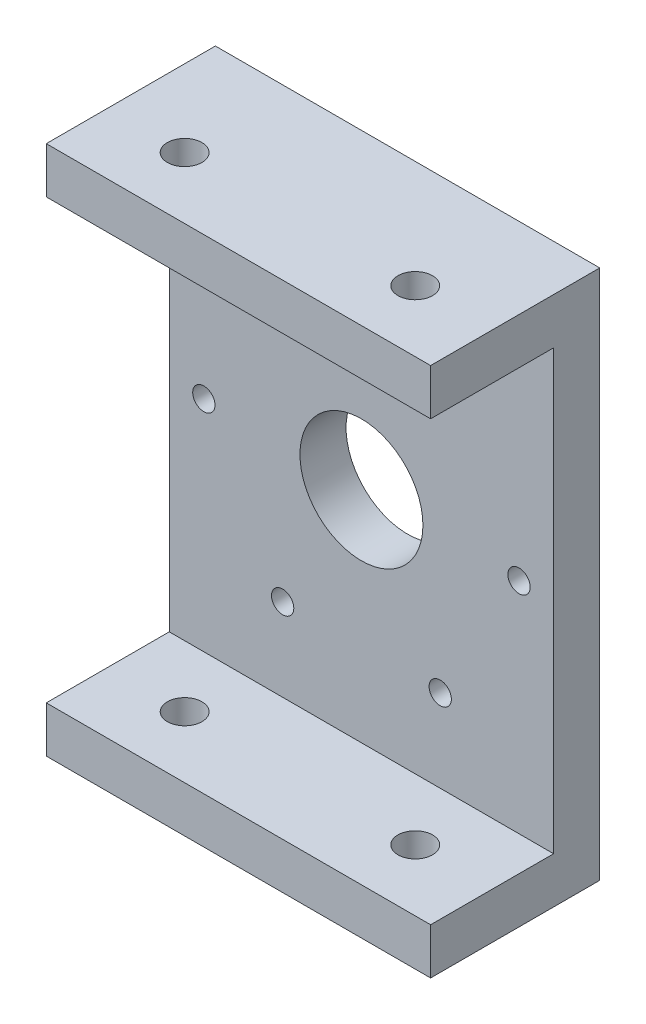
ISO-10303-21;
HEADER;
FILE_DESCRIPTION(('STEP AP214'),'2;1');
FILE_NAME('part.step','',(''),(''),'','','');
FILE_SCHEMA(('AUTOMOTIVE_DESIGN { 1 0 10303 214 1 1 1 1 }'));
ENDSEC;
DATA;
#1=APPLICATION_CONTEXT('core data for automotive mechanical design processes');
#2=APPLICATION_PROTOCOL_DEFINITION('international standard','automotive_design',2000,#1);
#3=PRODUCT_CONTEXT('',#1,'mechanical');
#4=PRODUCT('Part','Part','',(#3));
#5=PRODUCT_RELATED_PRODUCT_CATEGORY('part','',(#4));
#6=PRODUCT_DEFINITION_FORMATION('','',#4);
#7=PRODUCT_DEFINITION_CONTEXT('part definition',#1,'design');
#8=PRODUCT_DEFINITION('design','',#6,#7);
#9=PRODUCT_DEFINITION_SHAPE('','',#8);
#10=(LENGTH_UNIT() NAMED_UNIT(*) SI_UNIT(.MILLI.,.METRE.));
#11=(NAMED_UNIT(*) PLANE_ANGLE_UNIT() SI_UNIT($,.RADIAN.));
#12=(NAMED_UNIT(*) SI_UNIT($,.STERADIAN.) SOLID_ANGLE_UNIT());
#13=UNCERTAINTY_MEASURE_WITH_UNIT(LENGTH_MEASURE(1.E-05),#10,'distance_accuracy_value','');
#14=(GEOMETRIC_REPRESENTATION_CONTEXT(3) GLOBAL_UNCERTAINTY_ASSIGNED_CONTEXT((#13)) GLOBAL_UNIT_ASSIGNED_CONTEXT((#10,
#11,#12)) REPRESENTATION_CONTEXT('',''));
#15=CARTESIAN_POINT('',(0.,0.,0.));
#16=DIRECTION('',(0.,0.,1.));
#17=DIRECTION('',(1.,0.,0.));
#18=AXIS2_PLACEMENT_3D('',#15,#16,#17);
#19=CARTESIAN_POINT('',(0.,0.,526.));
#20=DIRECTION('',(0.,0.,-1.));
#21=DIRECTION('',(-1.,0.,0.));
#22=AXIS2_PLACEMENT_3D('',#19,#20,#21);
#23=PLANE('',#22);
#24=CARTESIAN_POINT('',(20.5,0.,526.));
#25=DIRECTION('',(0.,0.,1.));
#26=DIRECTION('',(1.,0.,0.));
#27=AXIS2_PLACEMENT_3D('',#24,#25,#26);
#28=CIRCLE('',#27,1.45);
#29=CARTESIAN_POINT('',(21.95,0.,526.));
#30=VERTEX_POINT('',#29);
#31=EDGE_CURVE('E180',#30,#30,#28,.T.);
#32=ORIENTED_EDGE('',*,*,#31,.F.);
#33=EDGE_LOOP('',(#32));
#34=FACE_BOUND('',#33,.T.);
#35=CARTESIAN_POINT('',(10.25,-17.753520777581,526.));
#36=DIRECTION('',(0.,0.,1.));
#37=DIRECTION('',(1.,0.,0.));
#38=AXIS2_PLACEMENT_3D('',#35,#36,#37);
#39=CIRCLE('',#38,1.45);
#40=CARTESIAN_POINT('',(11.7,-17.753520777581,526.));
#41=VERTEX_POINT('',#40);
#42=EDGE_CURVE('E151',#41,#41,#39,.T.);
#43=ORIENTED_EDGE('',*,*,#42,.F.);
#44=EDGE_LOOP('',(#43));
#45=FACE_BOUND('',#44,.T.);
#46=CARTESIAN_POINT('',(-10.25,-17.753520777581,526.));
#47=DIRECTION('',(0.,0.,1.));
#48=DIRECTION('',(1.,0.,0.));
#49=AXIS2_PLACEMENT_3D('',#46,#47,#48);
#50=CIRCLE('',#49,1.45);
#51=CARTESIAN_POINT('',(-8.80000000000001,-17.753520777581,526.));
#52=VERTEX_POINT('',#51);
#53=EDGE_CURVE('E193',#52,#52,#50,.T.);
#54=ORIENTED_EDGE('',*,*,#53,.F.);
#55=EDGE_LOOP('',(#54));
#56=FACE_BOUND('',#55,.T.);
#57=CARTESIAN_POINT('',(-20.5,0.,526.));
#58=DIRECTION('',(0.,0.,1.));
#59=DIRECTION('',(1.,0.,0.));
#60=AXIS2_PLACEMENT_3D('',#57,#58,#59);
#61=CIRCLE('',#60,1.45);
#62=CARTESIAN_POINT('',(-19.05,0.,526.));
#63=VERTEX_POINT('',#62);
#64=EDGE_CURVE('E212',#63,#63,#61,.T.);
#65=ORIENTED_EDGE('',*,*,#64,.F.);
#66=EDGE_LOOP('',(#65));
#67=FACE_BOUND('',#66,.T.);
#68=CARTESIAN_POINT('',(-10.25,17.753520777581,526.));
#69=DIRECTION('',(0.,0.,1.));
#70=DIRECTION('',(1.,0.,0.));
#71=AXIS2_PLACEMENT_3D('',#68,#69,#70);
#72=CIRCLE('',#71,1.45);
#73=CARTESIAN_POINT('',(-8.8,17.753520777581,526.));
#74=VERTEX_POINT('',#73);
#75=EDGE_CURVE('E206',#74,#74,#72,.T.);
#76=ORIENTED_EDGE('',*,*,#75,.F.);
#77=EDGE_LOOP('',(#76));
#78=FACE_BOUND('',#77,.T.);
#79=CARTESIAN_POINT('',(10.25,17.753520777581,526.));
#80=DIRECTION('',(0.,0.,1.));
#81=DIRECTION('',(1.,0.,0.));
#82=AXIS2_PLACEMENT_3D('',#79,#80,#81);
#83=CIRCLE('',#82,1.45);
#84=CARTESIAN_POINT('',(11.7,17.753520777581,526.));
#85=VERTEX_POINT('',#84);
#86=EDGE_CURVE('E196',#85,#85,#83,.T.);
#87=ORIENTED_EDGE('',*,*,#86,.F.);
#88=EDGE_LOOP('',(#87));
#89=FACE_BOUND('',#88,.T.);
#90=CARTESIAN_POINT('',(0.,0.,526.));
#91=DIRECTION('',(0.,0.,1.));
#92=DIRECTION('',(1.,0.,0.));
#93=AXIS2_PLACEMENT_3D('',#90,#91,#92);
#94=CIRCLE('',#93,8.);
#95=CARTESIAN_POINT('',(8.,0.,526.));
#96=VERTEX_POINT('',#95);
#97=EDGE_CURVE('E223',#96,#96,#94,.T.);
#98=ORIENTED_EDGE('',*,*,#97,.F.);
#99=EDGE_LOOP('',(#98));
#100=FACE_BOUND('',#99,.T.);
#101=DIRECTION('',(1.,0.,0.));
#102=VECTOR('',#101,1.);
#103=CARTESIAN_POINT('',(-25.,28.5,526.));
#104=LINE('',#103,#102);
#105=CARTESIAN_POINT('',(-25.,28.5,526.));
#106=VERTEX_POINT('',#105);
#107=CARTESIAN_POINT('',(25.,28.5,526.));
#108=VERTEX_POINT('',#107);
#109=EDGE_CURVE('E63',#106,#108,#104,.T.);
#110=ORIENTED_EDGE('',*,*,#109,.F.);
#111=DIRECTION('',(0.,-1.,0.));
#112=VECTOR('',#111,1.);
#113=CARTESIAN_POINT('',(-25.,-34.5,526.));
#114=LINE('',#113,#112);
#115=CARTESIAN_POINT('',(-25.,-28.5,526.));
#116=VERTEX_POINT('',#115);
#117=EDGE_CURVE('E232',#106,#116,#114,.T.);
#118=ORIENTED_EDGE('',*,*,#117,.T.);
#119=DIRECTION('',(-1.,0.,0.));
#120=VECTOR('',#119,1.);
#121=CARTESIAN_POINT('',(-25.,-28.5,526.));
#122=LINE('',#121,#120);
#123=CARTESIAN_POINT('',(25.,-28.5,526.));
#124=VERTEX_POINT('',#123);
#125=EDGE_CURVE('E68',#124,#116,#122,.T.);
#126=ORIENTED_EDGE('',*,*,#125,.F.);
#127=DIRECTION('',(0.,1.,0.));
#128=VECTOR('',#127,1.);
#129=CARTESIAN_POINT('',(25.,-34.5,526.));
#130=LINE('',#129,#128);
#131=EDGE_CURVE('E235',#124,#108,#130,.T.);
#132=ORIENTED_EDGE('',*,*,#131,.T.);
#133=EDGE_LOOP('',(#110,#118,#126,#132));
#134=FACE_BOUND('',#133,.T.);
#135=ADVANCED_FACE('F43',(#34,#45,#56,#67,#78,#89,#100,#134),#23,.F.);
#136=CARTESIAN_POINT('',(25.,-34.5,526.));
#137=DIRECTION('',(-1.,0.,0.));
#138=DIRECTION('',(0.,0.,1.));
#139=AXIS2_PLACEMENT_3D('',#136,#137,#138);
#140=PLANE('',#139);
#141=DIRECTION('',(0.,1.,0.));
#142=VECTOR('',#141,1.);
#143=CARTESIAN_POINT('',(25.,-34.5,520.));
#144=LINE('',#143,#142);
#145=CARTESIAN_POINT('',(25.,-34.5,520.));
#146=VERTEX_POINT('',#145);
#147=CARTESIAN_POINT('',(25.,34.5,520.));
#148=VERTEX_POINT('',#147);
#149=EDGE_CURVE('E118',#146,#148,#144,.T.);
#150=ORIENTED_EDGE('',*,*,#149,.T.);
#151=DIRECTION('',(0.,0.,-1.));
#152=VECTOR('',#151,1.);
#153=CARTESIAN_POINT('',(25.,34.5,526.));
#154=LINE('',#153,#152);
#155=CARTESIAN_POINT('',(25.,34.5,542.));
#156=VERTEX_POINT('',#155);
#157=EDGE_CURVE('E11',#156,#148,#154,.T.);
#158=ORIENTED_EDGE('',*,*,#157,.F.);
#159=DIRECTION('',(0.,1.,0.));
#160=VECTOR('',#159,1.);
#161=CARTESIAN_POINT('',(25.,28.5,542.));
#162=LINE('',#161,#160);
#163=CARTESIAN_POINT('',(25.,28.5,542.));
#164=VERTEX_POINT('',#163);
#165=EDGE_CURVE('E114',#164,#156,#162,.T.);
#166=ORIENTED_EDGE('',*,*,#165,.F.);
#167=DIRECTION('',(0.,0.,-1.));
#168=VECTOR('',#167,1.);
#169=CARTESIAN_POINT('',(25.,28.5,542.));
#170=LINE('',#169,#168);
#171=EDGE_CURVE('E141',#164,#108,#170,.T.);
#172=ORIENTED_EDGE('',*,*,#171,.T.);
#173=ORIENTED_EDGE('',*,*,#131,.F.);
#174=DIRECTION('',(0.,0.,-1.));
#175=VECTOR('',#174,1.);
#176=CARTESIAN_POINT('',(25.,-28.5,542.));
#177=LINE('',#176,#175);
#178=CARTESIAN_POINT('',(25.,-28.5,542.));
#179=VERTEX_POINT('',#178);
#180=EDGE_CURVE('E155',#179,#124,#177,.T.);
#181=ORIENTED_EDGE('',*,*,#180,.F.);
#182=DIRECTION('',(0.,1.,0.));
#183=VECTOR('',#182,1.);
#184=CARTESIAN_POINT('',(25.,-34.5,542.));
#185=LINE('',#184,#183);
#186=CARTESIAN_POINT('',(25.,-34.5,542.));
#187=VERTEX_POINT('',#186);
#188=EDGE_CURVE('E162',#187,#179,#185,.T.);
#189=ORIENTED_EDGE('',*,*,#188,.F.);
#190=DIRECTION('',(0.,0.,-1.));
#191=VECTOR('',#190,1.);
#192=CARTESIAN_POINT('',(25.,-34.5,526.));
#193=LINE('',#192,#191);
#194=EDGE_CURVE('E239',#187,#146,#193,.T.);
#195=ORIENTED_EDGE('',*,*,#194,.T.);
#196=EDGE_LOOP('',(#150,#158,#166,#172,#173,#181,#189,#195));
#197=FACE_BOUND('',#196,.T.);
#198=ADVANCED_FACE('F44',(#197),#140,.F.);
#199=CARTESIAN_POINT('',(-25.,34.5,526.));
#200=DIRECTION('',(0.,-1.,0.));
#201=DIRECTION('',(0.,0.,-1.));
#202=AXIS2_PLACEMENT_3D('',#199,#200,#201);
#203=PLANE('',#202);
#204=CARTESIAN_POINT('',(-15.,34.5,534.));
#205=DIRECTION('',(0.,1.,0.));
#206=DIRECTION('',(0.,0.,1.));
#207=AXIS2_PLACEMENT_3D('',#204,#205,#206);
#208=CIRCLE('',#207,2.25);
#209=CARTESIAN_POINT('',(-15.,34.5,536.25));
#210=VERTEX_POINT('',#209);
#211=EDGE_CURVE('E261',#210,#210,#208,.T.);
#212=ORIENTED_EDGE('',*,*,#211,.F.);
#213=EDGE_LOOP('',(#212));
#214=FACE_BOUND('',#213,.T.);
#215=CARTESIAN_POINT('',(15.,34.5,534.));
#216=DIRECTION('',(0.,1.,0.));
#217=DIRECTION('',(0.,0.,1.));
#218=AXIS2_PLACEMENT_3D('',#215,#216,#217);
#219=CIRCLE('',#218,2.25);
#220=CARTESIAN_POINT('',(15.,34.5,536.25));
#221=VERTEX_POINT('',#220);
#222=EDGE_CURVE('E278',#221,#221,#219,.T.);
#223=ORIENTED_EDGE('',*,*,#222,.F.);
#224=EDGE_LOOP('',(#223));
#225=FACE_BOUND('',#224,.T.);
#226=DIRECTION('',(-1.,0.,0.));
#227=VECTOR('',#226,1.);
#228=CARTESIAN_POINT('',(-25.,34.5,520.));
#229=LINE('',#228,#227);
#230=CARTESIAN_POINT('',(-25.,34.5,520.));
#231=VERTEX_POINT('',#230);
#232=EDGE_CURVE('E244',#148,#231,#229,.T.);
#233=ORIENTED_EDGE('',*,*,#232,.T.);
#234=DIRECTION('',(0.,0.,-1.));
#235=VECTOR('',#234,1.);
#236=CARTESIAN_POINT('',(-25.,34.5,526.));
#237=LINE('',#236,#235);
#238=CARTESIAN_POINT('',(-25.,34.5,542.));
#239=VERTEX_POINT('',#238);
#240=EDGE_CURVE('E52',#239,#231,#237,.T.);
#241=ORIENTED_EDGE('',*,*,#240,.F.);
#242=DIRECTION('',(-1.,0.,0.));
#243=VECTOR('',#242,1.);
#244=CARTESIAN_POINT('',(-25.,34.5,542.));
#245=LINE('',#244,#243);
#246=EDGE_CURVE('E120',#156,#239,#245,.T.);
#247=ORIENTED_EDGE('',*,*,#246,.F.);
#248=ORIENTED_EDGE('',*,*,#157,.T.);
#249=EDGE_LOOP('',(#233,#241,#247,#248));
#250=FACE_BOUND('',#249,.T.);
#251=ADVANCED_FACE('F116',(#214,#225,#250),#203,.F.);
#252=CARTESIAN_POINT('',(-25.,-34.5,526.));
#253=DIRECTION('',(1.,0.,0.));
#254=DIRECTION('',(0.,0.,-1.));
#255=AXIS2_PLACEMENT_3D('',#252,#253,#254);
#256=PLANE('',#255);
#257=DIRECTION('',(0.,-1.,0.));
#258=VECTOR('',#257,1.);
#259=CARTESIAN_POINT('',(-25.,-34.5,520.));
#260=LINE('',#259,#258);
#261=CARTESIAN_POINT('',(-25.,-34.5,520.));
#262=VERTEX_POINT('',#261);
#263=EDGE_CURVE('E241',#231,#262,#260,.T.);
#264=ORIENTED_EDGE('',*,*,#263,.T.);
#265=DIRECTION('',(0.,0.,-1.));
#266=VECTOR('',#265,1.);
#267=CARTESIAN_POINT('',(-25.,-34.5,526.));
#268=LINE('',#267,#266);
#269=CARTESIAN_POINT('',(-25.,-34.5,542.));
#270=VERTEX_POINT('',#269);
#271=EDGE_CURVE('E252',#270,#262,#268,.T.);
#272=ORIENTED_EDGE('',*,*,#271,.F.);
#273=DIRECTION('',(0.,-1.,0.));
#274=VECTOR('',#273,1.);
#275=CARTESIAN_POINT('',(-25.,-34.5,542.));
#276=LINE('',#275,#274);
#277=CARTESIAN_POINT('',(-25.,-28.5,542.));
#278=VERTEX_POINT('',#277);
#279=EDGE_CURVE('E170',#278,#270,#276,.T.);
#280=ORIENTED_EDGE('',*,*,#279,.F.);
#281=DIRECTION('',(0.,0.,-1.));
#282=VECTOR('',#281,1.);
#283=CARTESIAN_POINT('',(-25.,-28.5,542.));
#284=LINE('',#283,#282);
#285=EDGE_CURVE('E156',#278,#116,#284,.T.);
#286=ORIENTED_EDGE('',*,*,#285,.T.);
#287=ORIENTED_EDGE('',*,*,#117,.F.);
#288=DIRECTION('',(0.,0.,-1.));
#289=VECTOR('',#288,1.);
#290=CARTESIAN_POINT('',(-25.,28.5,542.));
#291=LINE('',#290,#289);
#292=CARTESIAN_POINT('',(-25.,28.5,542.));
#293=VERTEX_POINT('',#292);
#294=EDGE_CURVE('E150',#293,#106,#291,.T.);
#295=ORIENTED_EDGE('',*,*,#294,.F.);
#296=DIRECTION('',(0.,-1.,0.));
#297=VECTOR('',#296,1.);
#298=CARTESIAN_POINT('',(-25.,28.5,542.));
#299=LINE('',#298,#297);
#300=EDGE_CURVE('E122',#239,#293,#299,.T.);
#301=ORIENTED_EDGE('',*,*,#300,.F.);
#302=ORIENTED_EDGE('',*,*,#240,.T.);
#303=EDGE_LOOP('',(#264,#272,#280,#286,#287,#295,#301,#302));
#304=FACE_BOUND('',#303,.T.);
#305=ADVANCED_FACE('F290',(#304),#256,.F.);
#306=CARTESIAN_POINT('',(-25.,-34.5,526.));
#307=DIRECTION('',(0.,1.,0.));
#308=DIRECTION('',(0.,0.,1.));
#309=AXIS2_PLACEMENT_3D('',#306,#307,#308);
#310=PLANE('',#309);
#311=CARTESIAN_POINT('',(-15.,-34.5,534.));
#312=DIRECTION('',(0.,1.,0.));
#313=DIRECTION('',(0.,0.,1.));
#314=AXIS2_PLACEMENT_3D('',#311,#312,#313);
#315=CIRCLE('',#314,2.25);
#316=CARTESIAN_POINT('',(-15.,-34.5,536.25));
#317=VERTEX_POINT('',#316);
#318=EDGE_CURVE('E268',#317,#317,#315,.T.);
#319=ORIENTED_EDGE('',*,*,#318,.T.);
#320=EDGE_LOOP('',(#319));
#321=FACE_BOUND('',#320,.T.);
#322=CARTESIAN_POINT('',(15.,-34.5,534.));
#323=DIRECTION('',(0.,1.,0.));
#324=DIRECTION('',(0.,0.,1.));
#325=AXIS2_PLACEMENT_3D('',#322,#323,#324);
#326=CIRCLE('',#325,2.25);
#327=CARTESIAN_POINT('',(15.,-34.5,536.25));
#328=VERTEX_POINT('',#327);
#329=EDGE_CURVE('E273',#328,#328,#326,.T.);
#330=ORIENTED_EDGE('',*,*,#329,.T.);
#331=EDGE_LOOP('',(#330));
#332=FACE_BOUND('',#331,.T.);
#333=DIRECTION('',(1.,0.,0.));
#334=VECTOR('',#333,1.);
#335=CARTESIAN_POINT('',(-25.,-34.5,520.));
#336=LINE('',#335,#334);
#337=EDGE_CURVE('E237',#262,#146,#336,.T.);
#338=ORIENTED_EDGE('',*,*,#337,.T.);
#339=ORIENTED_EDGE('',*,*,#194,.F.);
#340=DIRECTION('',(1.,0.,0.));
#341=VECTOR('',#340,1.);
#342=CARTESIAN_POINT('',(-25.,-34.5,542.));
#343=LINE('',#342,#341);
#344=EDGE_CURVE('E159',#270,#187,#343,.T.);
#345=ORIENTED_EDGE('',*,*,#344,.F.);
#346=ORIENTED_EDGE('',*,*,#271,.T.);
#347=EDGE_LOOP('',(#338,#339,#345,#346));
#348=FACE_BOUND('',#347,.T.);
#349=ADVANCED_FACE('F295',(#321,#332,#348),#310,.F.);
#350=CARTESIAN_POINT('',(0.,0.,520.));
#351=DIRECTION('',(0.,0.,-1.));
#352=DIRECTION('',(-1.,0.,0.));
#353=AXIS2_PLACEMENT_3D('',#350,#351,#352);
#354=PLANE('',#353);
#355=CARTESIAN_POINT('',(20.5,0.,520.));
#356=DIRECTION('',(0.,0.,1.));
#357=DIRECTION('',(1.,0.,0.));
#358=AXIS2_PLACEMENT_3D('',#355,#356,#357);
#359=CIRCLE('',#358,1.45);
#360=CARTESIAN_POINT('',(21.95,0.,520.));
#361=VERTEX_POINT('',#360);
#362=EDGE_CURVE('E185',#361,#361,#359,.T.);
#363=ORIENTED_EDGE('',*,*,#362,.T.);
#364=EDGE_LOOP('',(#363));
#365=FACE_BOUND('',#364,.T.);
#366=CARTESIAN_POINT('',(10.25,-17.753520777581,520.));
#367=DIRECTION('',(0.,0.,1.));
#368=DIRECTION('',(1.,0.,0.));
#369=AXIS2_PLACEMENT_3D('',#366,#367,#368);
#370=CIRCLE('',#369,1.45);
#371=CARTESIAN_POINT('',(11.7,-17.753520777581,520.));
#372=VERTEX_POINT('',#371);
#373=EDGE_CURVE('E189',#372,#372,#370,.T.);
#374=ORIENTED_EDGE('',*,*,#373,.T.);
#375=EDGE_LOOP('',(#374));
#376=FACE_BOUND('',#375,.T.);
#377=CARTESIAN_POINT('',(-10.25,-17.753520777581,520.));
#378=DIRECTION('',(0.,0.,1.));
#379=DIRECTION('',(1.,0.,0.));
#380=AXIS2_PLACEMENT_3D('',#377,#378,#379);
#381=CIRCLE('',#380,1.45);
#382=CARTESIAN_POINT('',(-8.80000000000001,-17.753520777581,520.));
#383=VERTEX_POINT('',#382);
#384=EDGE_CURVE('E217',#383,#383,#381,.T.);
#385=ORIENTED_EDGE('',*,*,#384,.T.);
#386=EDGE_LOOP('',(#385));
#387=FACE_BOUND('',#386,.T.);
#388=CARTESIAN_POINT('',(-20.5,0.,520.));
#389=DIRECTION('',(0.,0.,1.));
#390=DIRECTION('',(1.,0.,0.));
#391=AXIS2_PLACEMENT_3D('',#388,#389,#390);
#392=CIRCLE('',#391,1.45);
#393=CARTESIAN_POINT('',(-19.05,0.,520.));
#394=VERTEX_POINT('',#393);
#395=EDGE_CURVE('E209',#394,#394,#392,.T.);
#396=ORIENTED_EDGE('',*,*,#395,.T.);
#397=EDGE_LOOP('',(#396));
#398=FACE_BOUND('',#397,.T.);
#399=CARTESIAN_POINT('',(-10.25,17.753520777581,520.));
#400=DIRECTION('',(0.,0.,1.));
#401=DIRECTION('',(1.,0.,0.));
#402=AXIS2_PLACEMENT_3D('',#399,#400,#401);
#403=CIRCLE('',#402,1.45);
#404=CARTESIAN_POINT('',(-8.8,17.753520777581,520.));
#405=VERTEX_POINT('',#404);
#406=EDGE_CURVE('E205',#405,#405,#403,.T.);
#407=ORIENTED_EDGE('',*,*,#406,.T.);
#408=EDGE_LOOP('',(#407));
#409=FACE_BOUND('',#408,.T.);
#410=CARTESIAN_POINT('',(10.25,17.753520777581,520.));
#411=DIRECTION('',(0.,0.,1.));
#412=DIRECTION('',(1.,0.,0.));
#413=AXIS2_PLACEMENT_3D('',#410,#411,#412);
#414=CIRCLE('',#413,1.45);
#415=CARTESIAN_POINT('',(11.7,17.753520777581,520.));
#416=VERTEX_POINT('',#415);
#417=EDGE_CURVE('E188',#416,#416,#414,.T.);
#418=ORIENTED_EDGE('',*,*,#417,.T.);
#419=EDGE_LOOP('',(#418));
#420=FACE_BOUND('',#419,.T.);
#421=CARTESIAN_POINT('',(0.,0.,520.));
#422=DIRECTION('',(0.,0.,1.));
#423=DIRECTION('',(1.,0.,0.));
#424=AXIS2_PLACEMENT_3D('',#421,#422,#423);
#425=CIRCLE('',#424,8.);
#426=CARTESIAN_POINT('',(8.,0.,520.));
#427=VERTEX_POINT('',#426);
#428=EDGE_CURVE('E182',#427,#427,#425,.T.);
#429=ORIENTED_EDGE('',*,*,#428,.T.);
#430=EDGE_LOOP('',(#429));
#431=FACE_BOUND('',#430,.T.);
#432=ORIENTED_EDGE('',*,*,#149,.F.);
#433=ORIENTED_EDGE('',*,*,#337,.F.);
#434=ORIENTED_EDGE('',*,*,#263,.F.);
#435=ORIENTED_EDGE('',*,*,#232,.F.);
#436=EDGE_LOOP('',(#432,#433,#434,#435));
#437=FACE_BOUND('',#436,.T.);
#438=ADVANCED_FACE('F302',(#365,#376,#387,#398,#409,#420,#431,#437),#354,.T.);
#439=CARTESIAN_POINT('',(0.,0.,526.));
#440=DIRECTION('',(0.,0.,-1.));
#441=DIRECTION('',(-1.,0.,0.));
#442=AXIS2_PLACEMENT_3D('',#439,#440,#441);
#443=CYLINDRICAL_SURFACE('',#442,8.);
#444=ORIENTED_EDGE('',*,*,#97,.T.);
#445=EDGE_LOOP('',(#444));
#446=FACE_BOUND('',#445,.T.);
#447=ORIENTED_EDGE('',*,*,#428,.F.);
#448=EDGE_LOOP('',(#447));
#449=FACE_BOUND('',#448,.T.);
#450=ADVANCED_FACE('F301',(#446,#449),#443,.F.);
#451=CARTESIAN_POINT('',(10.25,17.753520777581,526.));
#452=DIRECTION('',(0.,0.,-1.));
#453=DIRECTION('',(-1.,0.,0.));
#454=AXIS2_PLACEMENT_3D('',#451,#452,#453);
#455=CYLINDRICAL_SURFACE('',#454,1.45);
#456=ORIENTED_EDGE('',*,*,#86,.T.);
#457=EDGE_LOOP('',(#456));
#458=FACE_BOUND('',#457,.T.);
#459=ORIENTED_EDGE('',*,*,#417,.F.);
#460=EDGE_LOOP('',(#459));
#461=FACE_BOUND('',#460,.T.);
#462=ADVANCED_FACE('F348',(#458,#461),#455,.F.);
#463=CARTESIAN_POINT('',(-10.25,17.753520777581,526.));
#464=DIRECTION('',(0.,0.,-1.));
#465=DIRECTION('',(-1.,0.,0.));
#466=AXIS2_PLACEMENT_3D('',#463,#464,#465);
#467=CYLINDRICAL_SURFACE('',#466,1.45);
#468=ORIENTED_EDGE('',*,*,#75,.T.);
#469=EDGE_LOOP('',(#468));
#470=FACE_BOUND('',#469,.T.);
#471=ORIENTED_EDGE('',*,*,#406,.F.);
#472=EDGE_LOOP('',(#471));
#473=FACE_BOUND('',#472,.T.);
#474=ADVANCED_FACE('F352',(#470,#473),#467,.F.);
#475=CARTESIAN_POINT('',(-20.5,0.,526.));
#476=DIRECTION('',(0.,0.,-1.));
#477=DIRECTION('',(-1.,0.,0.));
#478=AXIS2_PLACEMENT_3D('',#475,#476,#477);
#479=CYLINDRICAL_SURFACE('',#478,1.45);
#480=ORIENTED_EDGE('',*,*,#64,.T.);
#481=EDGE_LOOP('',(#480));
#482=FACE_BOUND('',#481,.T.);
#483=ORIENTED_EDGE('',*,*,#395,.F.);
#484=EDGE_LOOP('',(#483));
#485=FACE_BOUND('',#484,.T.);
#486=ADVANCED_FACE('F360',(#482,#485),#479,.F.);
#487=CARTESIAN_POINT('',(-10.25,-17.753520777581,526.));
#488=DIRECTION('',(0.,0.,-1.));
#489=DIRECTION('',(-1.,0.,0.));
#490=AXIS2_PLACEMENT_3D('',#487,#488,#489);
#491=CYLINDRICAL_SURFACE('',#490,1.45);
#492=ORIENTED_EDGE('',*,*,#53,.T.);
#493=EDGE_LOOP('',(#492));
#494=FACE_BOUND('',#493,.T.);
#495=ORIENTED_EDGE('',*,*,#384,.F.);
#496=EDGE_LOOP('',(#495));
#497=FACE_BOUND('',#496,.T.);
#498=ADVANCED_FACE('F346',(#494,#497),#491,.F.);
#499=CARTESIAN_POINT('',(10.25,-17.753520777581,526.));
#500=DIRECTION('',(0.,0.,-1.));
#501=DIRECTION('',(-1.,0.,0.));
#502=AXIS2_PLACEMENT_3D('',#499,#500,#501);
#503=CYLINDRICAL_SURFACE('',#502,1.45);
#504=ORIENTED_EDGE('',*,*,#42,.T.);
#505=EDGE_LOOP('',(#504));
#506=FACE_BOUND('',#505,.T.);
#507=ORIENTED_EDGE('',*,*,#373,.F.);
#508=EDGE_LOOP('',(#507));
#509=FACE_BOUND('',#508,.T.);
#510=ADVANCED_FACE('F344',(#506,#509),#503,.F.);
#511=CARTESIAN_POINT('',(20.5,0.,526.));
#512=DIRECTION('',(0.,0.,-1.));
#513=DIRECTION('',(-1.,0.,0.));
#514=AXIS2_PLACEMENT_3D('',#511,#512,#513);
#515=CYLINDRICAL_SURFACE('',#514,1.45);
#516=ORIENTED_EDGE('',*,*,#31,.T.);
#517=EDGE_LOOP('',(#516));
#518=FACE_BOUND('',#517,.T.);
#519=ORIENTED_EDGE('',*,*,#362,.F.);
#520=EDGE_LOOP('',(#519));
#521=FACE_BOUND('',#520,.T.);
#522=ADVANCED_FACE('F337',(#518,#521),#515,.F.);
#523=CARTESIAN_POINT('',(-25.,-28.5,542.));
#524=DIRECTION('',(0.,-1.,0.));
#525=DIRECTION('',(0.,0.,-1.));
#526=AXIS2_PLACEMENT_3D('',#523,#524,#525);
#527=PLANE('',#526);
#528=CARTESIAN_POINT('',(-15.,-28.5,534.));
#529=DIRECTION('',(0.,-1.,0.));
#530=DIRECTION('',(0.,0.,-1.));
#531=AXIS2_PLACEMENT_3D('',#528,#529,#530);
#532=CIRCLE('',#531,2.25);
#533=CARTESIAN_POINT('',(-15.,-28.5,531.75));
#534=VERTEX_POINT('',#533);
#535=EDGE_CURVE('E140',#534,#534,#532,.F.);
#536=ORIENTED_EDGE('',*,*,#535,.F.);
#537=EDGE_LOOP('',(#536));
#538=FACE_BOUND('',#537,.T.);
#539=CARTESIAN_POINT('',(15.,-28.5,534.));
#540=DIRECTION('',(0.,-1.,0.));
#541=DIRECTION('',(0.,0.,-1.));
#542=AXIS2_PLACEMENT_3D('',#539,#540,#541);
#543=CIRCLE('',#542,2.25);
#544=CARTESIAN_POINT('',(15.,-28.5,531.75));
#545=VERTEX_POINT('',#544);
#546=EDGE_CURVE('E257',#545,#545,#543,.F.);
#547=ORIENTED_EDGE('',*,*,#546,.F.);
#548=EDGE_LOOP('',(#547));
#549=FACE_BOUND('',#548,.T.);
#550=ORIENTED_EDGE('',*,*,#125,.T.);
#551=ORIENTED_EDGE('',*,*,#285,.F.);
#552=DIRECTION('',(-1.,0.,0.));
#553=VECTOR('',#552,1.);
#554=CARTESIAN_POINT('',(-25.,-28.5,542.));
#555=LINE('',#554,#553);
#556=EDGE_CURVE('E173',#179,#278,#555,.T.);
#557=ORIENTED_EDGE('',*,*,#556,.F.);
#558=ORIENTED_EDGE('',*,*,#180,.T.);
#559=EDGE_LOOP('',(#550,#551,#557,#558));
#560=FACE_BOUND('',#559,.T.);
#561=ADVANCED_FACE('F326',(#538,#549,#560),#527,.F.);
#562=CARTESIAN_POINT('',(0.,0.,542.));
#563=DIRECTION('',(0.,0.,-1.));
#564=DIRECTION('',(-1.,0.,0.));
#565=AXIS2_PLACEMENT_3D('',#562,#563,#564);
#566=PLANE('',#565);
#567=ORIENTED_EDGE('',*,*,#188,.T.);
#568=ORIENTED_EDGE('',*,*,#556,.T.);
#569=ORIENTED_EDGE('',*,*,#279,.T.);
#570=ORIENTED_EDGE('',*,*,#344,.T.);
#571=EDGE_LOOP('',(#567,#568,#569,#570));
#572=FACE_BOUND('',#571,.T.);
#573=ADVANCED_FACE('F329',(#572),#566,.F.);
#574=CARTESIAN_POINT('',(-25.,28.5,542.));
#575=DIRECTION('',(0.,1.,0.));
#576=DIRECTION('',(0.,0.,1.));
#577=AXIS2_PLACEMENT_3D('',#574,#575,#576);
#578=PLANE('',#577);
#579=CARTESIAN_POINT('',(-15.,28.5,534.));
#580=DIRECTION('',(0.,1.,0.));
#581=DIRECTION('',(0.,0.,1.));
#582=AXIS2_PLACEMENT_3D('',#579,#580,#581);
#583=CIRCLE('',#582,2.25);
#584=CARTESIAN_POINT('',(-15.,28.5,536.25));
#585=VERTEX_POINT('',#584);
#586=EDGE_CURVE('E50',#585,#585,#583,.F.);
#587=ORIENTED_EDGE('',*,*,#586,.F.);
#588=EDGE_LOOP('',(#587));
#589=FACE_BOUND('',#588,.T.);
#590=CARTESIAN_POINT('',(15.,28.5,534.));
#591=DIRECTION('',(0.,1.,0.));
#592=DIRECTION('',(0.,0.,1.));
#593=AXIS2_PLACEMENT_3D('',#590,#591,#592);
#594=CIRCLE('',#593,2.25);
#595=CARTESIAN_POINT('',(15.,28.5,536.25));
#596=VERTEX_POINT('',#595);
#597=EDGE_CURVE('E260',#596,#596,#594,.F.);
#598=ORIENTED_EDGE('',*,*,#597,.F.);
#599=EDGE_LOOP('',(#598));
#600=FACE_BOUND('',#599,.T.);
#601=ORIENTED_EDGE('',*,*,#109,.T.);
#602=ORIENTED_EDGE('',*,*,#171,.F.);
#603=DIRECTION('',(1.,0.,0.));
#604=VECTOR('',#603,1.);
#605=CARTESIAN_POINT('',(-25.,28.5,542.));
#606=LINE('',#605,#604);
#607=EDGE_CURVE('E129',#293,#164,#606,.T.);
#608=ORIENTED_EDGE('',*,*,#607,.F.);
#609=ORIENTED_EDGE('',*,*,#294,.T.);
#610=EDGE_LOOP('',(#601,#602,#608,#609));
#611=FACE_BOUND('',#610,.T.);
#612=ADVANCED_FACE('F322',(#589,#600,#611),#578,.F.);
#613=CARTESIAN_POINT('',(0.,0.,542.));
#614=DIRECTION('',(0.,0.,-1.));
#615=DIRECTION('',(-1.,0.,0.));
#616=AXIS2_PLACEMENT_3D('',#613,#614,#615);
#617=PLANE('',#616);
#618=ORIENTED_EDGE('',*,*,#165,.T.);
#619=ORIENTED_EDGE('',*,*,#246,.T.);
#620=ORIENTED_EDGE('',*,*,#300,.T.);
#621=ORIENTED_EDGE('',*,*,#607,.T.);
#622=EDGE_LOOP('',(#618,#619,#620,#621));
#623=FACE_BOUND('',#622,.T.);
#624=ADVANCED_FACE('F130',(#623),#617,.F.);
#625=CARTESIAN_POINT('',(15.,34.5,534.));
#626=DIRECTION('',(0.,-1.,0.));
#627=DIRECTION('',(0.,0.,-1.));
#628=AXIS2_PLACEMENT_3D('',#625,#626,#627);
#629=CYLINDRICAL_SURFACE('',#628,2.25);
#630=ORIENTED_EDGE('',*,*,#222,.T.);
#631=EDGE_LOOP('',(#630));
#632=FACE_BOUND('',#631,.T.);
#633=ORIENTED_EDGE('',*,*,#597,.T.);
#634=EDGE_LOOP('',(#633));
#635=FACE_BOUND('',#634,.T.);
#636=ADVANCED_FACE('F285',(#632,#635),#629,.F.);
#637=CARTESIAN_POINT('',(-15.,34.5,534.));
#638=DIRECTION('',(0.,-1.,0.));
#639=DIRECTION('',(0.,0.,-1.));
#640=AXIS2_PLACEMENT_3D('',#637,#638,#639);
#641=CYLINDRICAL_SURFACE('',#640,2.25);
#642=ORIENTED_EDGE('',*,*,#211,.T.);
#643=EDGE_LOOP('',(#642));
#644=FACE_BOUND('',#643,.T.);
#645=ORIENTED_EDGE('',*,*,#586,.T.);
#646=EDGE_LOOP('',(#645));
#647=FACE_BOUND('',#646,.T.);
#648=ADVANCED_FACE('F473',(#644,#647),#641,.F.);
#649=ORIENTED_EDGE('',*,*,#329,.F.);
#650=EDGE_LOOP('',(#649));
#651=FACE_BOUND('',#650,.T.);
#652=ORIENTED_EDGE('',*,*,#546,.T.);
#653=EDGE_LOOP('',(#652));
#654=FACE_BOUND('',#653,.T.);
#655=ADVANCED_FACE('F471',(#651,#654),#629,.F.);
#656=ORIENTED_EDGE('',*,*,#318,.F.);
#657=EDGE_LOOP('',(#656));
#658=FACE_BOUND('',#657,.T.);
#659=ORIENTED_EDGE('',*,*,#535,.T.);
#660=EDGE_LOOP('',(#659));
#661=FACE_BOUND('',#660,.T.);
#662=ADVANCED_FACE('F485',(#658,#661),#641,.F.);
#663=CLOSED_SHELL('',(#135,#198,#251,#305,#349,#438,#450,#462,#474,#486,#498,#510,#522,#561,
#573,#612,#624,#636,#648,#655,#662));
#664=MANIFOLD_SOLID_BREP('B2',#663);
#665=ADVANCED_BREP_SHAPE_REPRESENTATION('',(#18,#664),#14);
#666=SHAPE_DEFINITION_REPRESENTATION(#9,#665);
ENDSEC;
END-ISO-10303-21;
